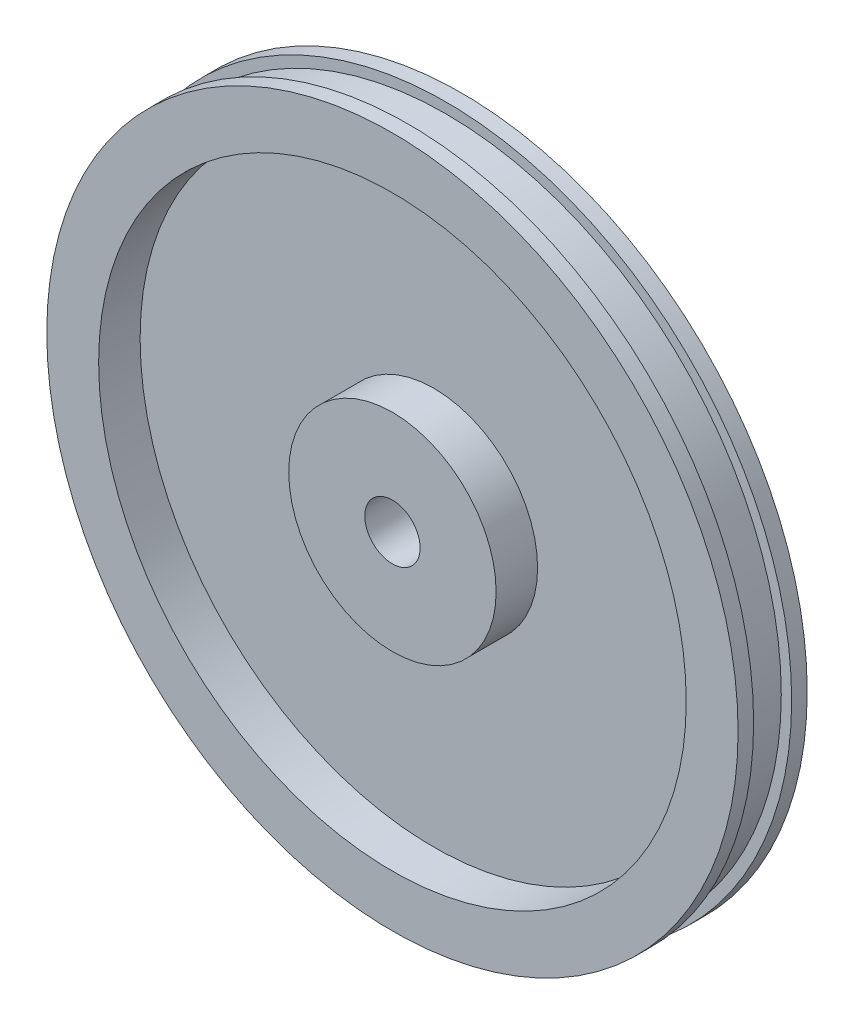
ISO-10303-21;
HEADER;
FILE_DESCRIPTION(('STEP AP214'),'2;1');
FILE_NAME('part.step','',(''),(''),'','','');
FILE_SCHEMA(('AUTOMOTIVE_DESIGN { 1 0 10303 214 1 1 1 1 }'));
ENDSEC;
DATA;
#1=APPLICATION_CONTEXT('core data for automotive mechanical design processes');
#2=APPLICATION_PROTOCOL_DEFINITION('international standard','automotive_design',2000,#1);
#3=PRODUCT_CONTEXT('',#1,'mechanical');
#4=PRODUCT('Part','Part','',(#3));
#5=PRODUCT_RELATED_PRODUCT_CATEGORY('part','',(#4));
#6=PRODUCT_DEFINITION_FORMATION('','',#4);
#7=PRODUCT_DEFINITION_CONTEXT('part definition',#1,'design');
#8=PRODUCT_DEFINITION('design','',#6,#7);
#9=PRODUCT_DEFINITION_SHAPE('','',#8);
#10=(LENGTH_UNIT() NAMED_UNIT(*) SI_UNIT(.MILLI.,.METRE.));
#11=(NAMED_UNIT(*) PLANE_ANGLE_UNIT() SI_UNIT($,.RADIAN.));
#12=(NAMED_UNIT(*) SI_UNIT($,.STERADIAN.) SOLID_ANGLE_UNIT());
#13=UNCERTAINTY_MEASURE_WITH_UNIT(LENGTH_MEASURE(1.E-05),#10,'distance_accuracy_value','');
#14=(GEOMETRIC_REPRESENTATION_CONTEXT(3) GLOBAL_UNCERTAINTY_ASSIGNED_CONTEXT((#13)) GLOBAL_UNIT_ASSIGNED_CONTEXT((#10,
#11,#12)) REPRESENTATION_CONTEXT('',''));
#15=CARTESIAN_POINT('',(0.,0.,0.));
#16=DIRECTION('',(0.,0.,1.));
#17=DIRECTION('',(1.,0.,0.));
#18=AXIS2_PLACEMENT_3D('',#15,#16,#17);
#19=CARTESIAN_POINT('',(0.,0.,0.));
#20=DIRECTION('',(0.,0.,1.));
#21=DIRECTION('',(1.,0.,0.));
#22=AXIS2_PLACEMENT_3D('',#19,#20,#21);
#23=PLANE('',#22);
#24=CARTESIAN_POINT('',(0.,0.,0.));
#25=DIRECTION('',(0.,0.,1.));
#26=DIRECTION('',(1.,0.,0.));
#27=AXIS2_PLACEMENT_3D('',#24,#25,#26);
#28=CIRCLE('',#27,100.);
#29=CARTESIAN_POINT('',(100.,0.,0.));
#30=VERTEX_POINT('',#29);
#31=EDGE_CURVE('E41',#30,#30,#28,.T.);
#32=ORIENTED_EDGE('',*,*,#31,.F.);
#33=EDGE_LOOP('',(#32));
#34=FACE_BOUND('',#33,.T.);
#35=CARTESIAN_POINT('',(0.,0.,0.));
#36=DIRECTION('',(0.,0.,1.));
#37=DIRECTION('',(1.,0.,0.));
#38=AXIS2_PLACEMENT_3D('',#35,#36,#37);
#39=CIRCLE('',#38,30.);
#40=CARTESIAN_POINT('',(30.,0.,0.));
#41=VERTEX_POINT('',#40);
#42=EDGE_CURVE('E10',#41,#41,#39,.F.);
#43=ORIENTED_EDGE('',*,*,#42,.F.);
#44=EDGE_LOOP('',(#43));
#45=FACE_BOUND('',#44,.T.);
#46=ADVANCED_FACE('F30',(#34,#45),#23,.F.);
#47=CARTESIAN_POINT('',(0.,0.,20.));
#48=DIRECTION('',(0.,0.,-1.));
#49=DIRECTION('',(-1.,0.,0.));
#50=AXIS2_PLACEMENT_3D('',#47,#48,#49);
#51=CYLINDRICAL_SURFACE('',#50,100.);
#52=ORIENTED_EDGE('',*,*,#31,.T.);
#53=EDGE_LOOP('',(#52));
#54=FACE_BOUND('',#53,.T.);
#55=CARTESIAN_POINT('',(0.,0.,4.5));
#56=DIRECTION('',(0.,0.,-1.));
#57=DIRECTION('',(-1.,0.,0.));
#58=AXIS2_PLACEMENT_3D('',#55,#56,#57);
#59=CIRCLE('',#58,100.);
#60=CARTESIAN_POINT('',(-100.,0.,4.5));
#61=VERTEX_POINT('',#60);
#62=EDGE_CURVE('E60',#61,#61,#59,.T.);
#63=ORIENTED_EDGE('',*,*,#62,.T.);
#64=EDGE_LOOP('',(#63));
#65=FACE_BOUND('',#64,.T.);
#66=ADVANCED_FACE('F32',(#54,#65),#51,.T.);
#67=CARTESIAN_POINT('',(0.,0.,20.));
#68=DIRECTION('',(0.,0.,1.));
#69=DIRECTION('',(1.,0.,0.));
#70=AXIS2_PLACEMENT_3D('',#67,#68,#69);
#71=CIRCLE('',#70,100.);
#72=CARTESIAN_POINT('',(100.,0.,20.));
#73=VERTEX_POINT('',#72);
#74=EDGE_CURVE('E37',#73,#73,#71,.T.);
#75=ORIENTED_EDGE('',*,*,#74,.F.);
#76=EDGE_LOOP('',(#75));
#77=FACE_BOUND('',#76,.T.);
#78=CARTESIAN_POINT('',(0.,0.,15.5));
#79=DIRECTION('',(0.,0.,-1.));
#80=DIRECTION('',(-1.,0.,0.));
#81=AXIS2_PLACEMENT_3D('',#78,#79,#80);
#82=CIRCLE('',#81,100.);
#83=CARTESIAN_POINT('',(-100.,0.,15.5));
#84=VERTEX_POINT('',#83);
#85=EDGE_CURVE('E71',#84,#84,#82,.T.);
#86=ORIENTED_EDGE('',*,*,#85,.F.);
#87=EDGE_LOOP('',(#86));
#88=FACE_BOUND('',#87,.T.);
#89=ADVANCED_FACE('F104',(#77,#88),#51,.T.);
#90=CARTESIAN_POINT('',(0.,0.,20.));
#91=DIRECTION('',(0.,0.,1.));
#92=DIRECTION('',(1.,0.,0.));
#93=AXIS2_PLACEMENT_3D('',#90,#91,#92);
#94=PLANE('',#93);
#95=CARTESIAN_POINT('',(0.,0.,20.));
#96=DIRECTION('',(0.,0.,1.));
#97=DIRECTION('',(1.,0.,0.));
#98=AXIS2_PLACEMENT_3D('',#95,#96,#97);
#99=CIRCLE('',#98,8.);
#100=CARTESIAN_POINT('',(8.,0.,20.));
#101=VERTEX_POINT('',#100);
#102=EDGE_CURVE('E46',#101,#101,#99,.T.);
#103=ORIENTED_EDGE('',*,*,#102,.F.);
#104=EDGE_LOOP('',(#103));
#105=FACE_BOUND('',#104,.T.);
#106=CARTESIAN_POINT('',(0.,0.,20.));
#107=DIRECTION('',(0.,0.,1.));
#108=DIRECTION('',(1.,0.,0.));
#109=AXIS2_PLACEMENT_3D('',#106,#107,#108);
#110=CIRCLE('',#109,30.);
#111=CARTESIAN_POINT('',(30.,0.,20.));
#112=VERTEX_POINT('',#111);
#113=EDGE_CURVE('E57',#112,#112,#110,.T.);
#114=ORIENTED_EDGE('',*,*,#113,.T.);
#115=EDGE_LOOP('',(#114));
#116=FACE_BOUND('',#115,.T.);
#117=ADVANCED_FACE('F112',(#105,#116),#94,.T.);
#118=CARTESIAN_POINT('',(0.,0.,20.));
#119=DIRECTION('',(0.,0.,1.));
#120=DIRECTION('',(1.,0.,0.));
#121=AXIS2_PLACEMENT_3D('',#118,#119,#120);
#122=CIRCLE('',#121,85.);
#123=CARTESIAN_POINT('',(85.,0.,20.));
#124=VERTEX_POINT('',#123);
#125=EDGE_CURVE('E51',#124,#124,#122,.T.);
#126=ORIENTED_EDGE('',*,*,#125,.F.);
#127=EDGE_LOOP('',(#126));
#128=FACE_BOUND('',#127,.T.);
#129=ORIENTED_EDGE('',*,*,#74,.T.);
#130=EDGE_LOOP('',(#129));
#131=FACE_BOUND('',#130,.T.);
#132=ADVANCED_FACE('F109',(#128,#131),#94,.T.);
#133=CARTESIAN_POINT('',(0.,0.,0.));
#134=DIRECTION('',(0.,0.,1.));
#135=DIRECTION('',(1.,0.,0.));
#136=AXIS2_PLACEMENT_3D('',#133,#134,#135);
#137=CYLINDRICAL_SURFACE('',#136,8.);
#138=ORIENTED_EDGE('',*,*,#102,.T.);
#139=EDGE_LOOP('',(#138));
#140=FACE_BOUND('',#139,.T.);
#141=CARTESIAN_POINT('',(0.,0.,-6.));
#142=DIRECTION('',(0.,0.,-1.));
#143=DIRECTION('',(-1.,0.,0.));
#144=AXIS2_PLACEMENT_3D('',#141,#142,#143);
#145=CIRCLE('',#144,8.);
#146=CARTESIAN_POINT('',(-8.,0.,-6.));
#147=VERTEX_POINT('',#146);
#148=EDGE_CURVE('E77',#147,#147,#145,.T.);
#149=ORIENTED_EDGE('',*,*,#148,.T.);
#150=EDGE_LOOP('',(#149));
#151=FACE_BOUND('',#150,.T.);
#152=ADVANCED_FACE('F81',(#140,#151),#137,.F.);
#153=CARTESIAN_POINT('',(0.,0.,8.));
#154=DIRECTION('',(0.,0.,1.));
#155=DIRECTION('',(1.,0.,0.));
#156=AXIS2_PLACEMENT_3D('',#153,#154,#155);
#157=CYLINDRICAL_SURFACE('',#156,85.);
#158=CARTESIAN_POINT('',(0.,0.,8.));
#159=DIRECTION('',(0.,0.,1.));
#160=DIRECTION('',(1.,0.,0.));
#161=AXIS2_PLACEMENT_3D('',#158,#159,#160);
#162=CIRCLE('',#161,85.);
#163=CARTESIAN_POINT('',(85.,0.,8.));
#164=VERTEX_POINT('',#163);
#165=EDGE_CURVE('E50',#164,#164,#162,.T.);
#166=ORIENTED_EDGE('',*,*,#165,.F.);
#167=EDGE_LOOP('',(#166));
#168=FACE_BOUND('',#167,.T.);
#169=ORIENTED_EDGE('',*,*,#125,.T.);
#170=EDGE_LOOP('',(#169));
#171=FACE_BOUND('',#170,.T.);
#172=ADVANCED_FACE('F116',(#168,#171),#157,.F.);
#173=CARTESIAN_POINT('',(0.,0.,8.));
#174=DIRECTION('',(0.,0.,1.));
#175=DIRECTION('',(1.,0.,0.));
#176=AXIS2_PLACEMENT_3D('',#173,#174,#175);
#177=PLANE('',#176);
#178=CARTESIAN_POINT('',(0.,0.,8.));
#179=DIRECTION('',(0.,0.,1.));
#180=DIRECTION('',(1.,0.,0.));
#181=AXIS2_PLACEMENT_3D('',#178,#179,#180);
#182=CIRCLE('',#181,30.);
#183=CARTESIAN_POINT('',(30.,0.,8.));
#184=VERTEX_POINT('',#183);
#185=EDGE_CURVE('E54',#184,#184,#182,.T.);
#186=ORIENTED_EDGE('',*,*,#185,.F.);
#187=EDGE_LOOP('',(#186));
#188=FACE_BOUND('',#187,.T.);
#189=ORIENTED_EDGE('',*,*,#165,.T.);
#190=EDGE_LOOP('',(#189));
#191=FACE_BOUND('',#190,.T.);
#192=ADVANCED_FACE('F120',(#188,#191),#177,.T.);
#193=CARTESIAN_POINT('',(0.,0.,8.));
#194=DIRECTION('',(0.,0.,1.));
#195=DIRECTION('',(1.,0.,0.));
#196=AXIS2_PLACEMENT_3D('',#193,#194,#195);
#197=CYLINDRICAL_SURFACE('',#196,30.);
#198=ORIENTED_EDGE('',*,*,#185,.T.);
#199=EDGE_LOOP('',(#198));
#200=FACE_BOUND('',#199,.T.);
#201=ORIENTED_EDGE('',*,*,#113,.F.);
#202=EDGE_LOOP('',(#201));
#203=FACE_BOUND('',#202,.T.);
#204=ADVANCED_FACE('F124',(#200,#203),#197,.T.);
#205=CARTESIAN_POINT('',(97.,0.,4.5));
#206=DIRECTION('',(0.,0.,1.));
#207=DIRECTION('',(1.,0.,0.));
#208=AXIS2_PLACEMENT_3D('',#205,#206,#207);
#209=PLANE('',#208);
#210=CARTESIAN_POINT('',(0.,0.,4.5));
#211=DIRECTION('',(0.,0.,-1.));
#212=DIRECTION('',(-1.,0.,0.));
#213=AXIS2_PLACEMENT_3D('',#210,#211,#212);
#214=CIRCLE('',#213,97.);
#215=CARTESIAN_POINT('',(-97.,0.,4.5));
#216=VERTEX_POINT('',#215);
#217=EDGE_CURVE('E65',#216,#216,#214,.T.);
#218=ORIENTED_EDGE('',*,*,#217,.T.);
#219=EDGE_LOOP('',(#218));
#220=FACE_BOUND('',#219,.T.);
#221=ORIENTED_EDGE('',*,*,#62,.F.);
#222=EDGE_LOOP('',(#221));
#223=FACE_BOUND('',#222,.T.);
#224=ADVANCED_FACE('F128',(#220,#223),#209,.T.);
#225=CARTESIAN_POINT('',(0.,0.,-40.3035481023132));
#226=DIRECTION('',(0.,0.,-1.));
#227=DIRECTION('',(-1.,0.,0.));
#228=AXIS2_PLACEMENT_3D('',#225,#226,#227);
#229=CYLINDRICAL_SURFACE('',#228,97.);
#230=CARTESIAN_POINT('',(0.,0.,15.5));
#231=DIRECTION('',(0.,0.,-1.));
#232=DIRECTION('',(-1.,0.,0.));
#233=AXIS2_PLACEMENT_3D('',#230,#231,#232);
#234=CIRCLE('',#233,97.);
#235=CARTESIAN_POINT('',(-97.,0.,15.5));
#236=VERTEX_POINT('',#235);
#237=EDGE_CURVE('E68',#236,#236,#234,.T.);
#238=ORIENTED_EDGE('',*,*,#237,.T.);
#239=EDGE_LOOP('',(#238));
#240=FACE_BOUND('',#239,.T.);
#241=ORIENTED_EDGE('',*,*,#217,.F.);
#242=EDGE_LOOP('',(#241));
#243=FACE_BOUND('',#242,.T.);
#244=ADVANCED_FACE('F96',(#240,#243),#229,.T.);
#245=CARTESIAN_POINT('',(97.,0.,15.5));
#246=DIRECTION('',(0.,0.,-1.));
#247=DIRECTION('',(-1.,0.,0.));
#248=AXIS2_PLACEMENT_3D('',#245,#246,#247);
#249=PLANE('',#248);
#250=ORIENTED_EDGE('',*,*,#85,.T.);
#251=EDGE_LOOP('',(#250));
#252=FACE_BOUND('',#251,.T.);
#253=ORIENTED_EDGE('',*,*,#237,.F.);
#254=EDGE_LOOP('',(#253));
#255=FACE_BOUND('',#254,.T.);
#256=ADVANCED_FACE('F91',(#252,#255),#249,.T.);
#257=CARTESIAN_POINT('',(0.,0.,-6.));
#258=DIRECTION('',(0.,0.,1.));
#259=DIRECTION('',(1.,0.,0.));
#260=AXIS2_PLACEMENT_3D('',#257,#258,#259);
#261=CYLINDRICAL_SURFACE('',#260,30.);
#262=CARTESIAN_POINT('',(0.,0.,-6.));
#263=DIRECTION('',(0.,0.,-1.));
#264=DIRECTION('',(-1.,0.,0.));
#265=AXIS2_PLACEMENT_3D('',#262,#263,#264);
#266=CIRCLE('',#265,30.);
#267=CARTESIAN_POINT('',(-30.,0.,-6.));
#268=VERTEX_POINT('',#267);
#269=EDGE_CURVE('E74',#268,#268,#266,.T.);
#270=ORIENTED_EDGE('',*,*,#269,.F.);
#271=EDGE_LOOP('',(#270));
#272=FACE_BOUND('',#271,.T.);
#273=ORIENTED_EDGE('',*,*,#42,.T.);
#274=EDGE_LOOP('',(#273));
#275=FACE_BOUND('',#274,.T.);
#276=ADVANCED_FACE('F86',(#272,#275),#261,.T.);
#277=CARTESIAN_POINT('',(0.,0.,-6.));
#278=DIRECTION('',(0.,0.,-1.));
#279=DIRECTION('',(-1.,0.,0.));
#280=AXIS2_PLACEMENT_3D('',#277,#278,#279);
#281=PLANE('',#280);
#282=ORIENTED_EDGE('',*,*,#148,.F.);
#283=EDGE_LOOP('',(#282));
#284=FACE_BOUND('',#283,.T.);
#285=ORIENTED_EDGE('',*,*,#269,.T.);
#286=EDGE_LOOP('',(#285));
#287=FACE_BOUND('',#286,.T.);
#288=ADVANCED_FACE('F83',(#284,#287),#281,.T.);
#289=CLOSED_SHELL('',(#46,#66,#89,#117,#132,#152,#172,#192,#204,#224,#244,#256,#276,#288));
#290=MANIFOLD_SOLID_BREP('B2',#289);
#291=ADVANCED_BREP_SHAPE_REPRESENTATION('',(#18,#290),#14);
#292=SHAPE_DEFINITION_REPRESENTATION(#9,#291);
ENDSEC;
END-ISO-10303-21;
